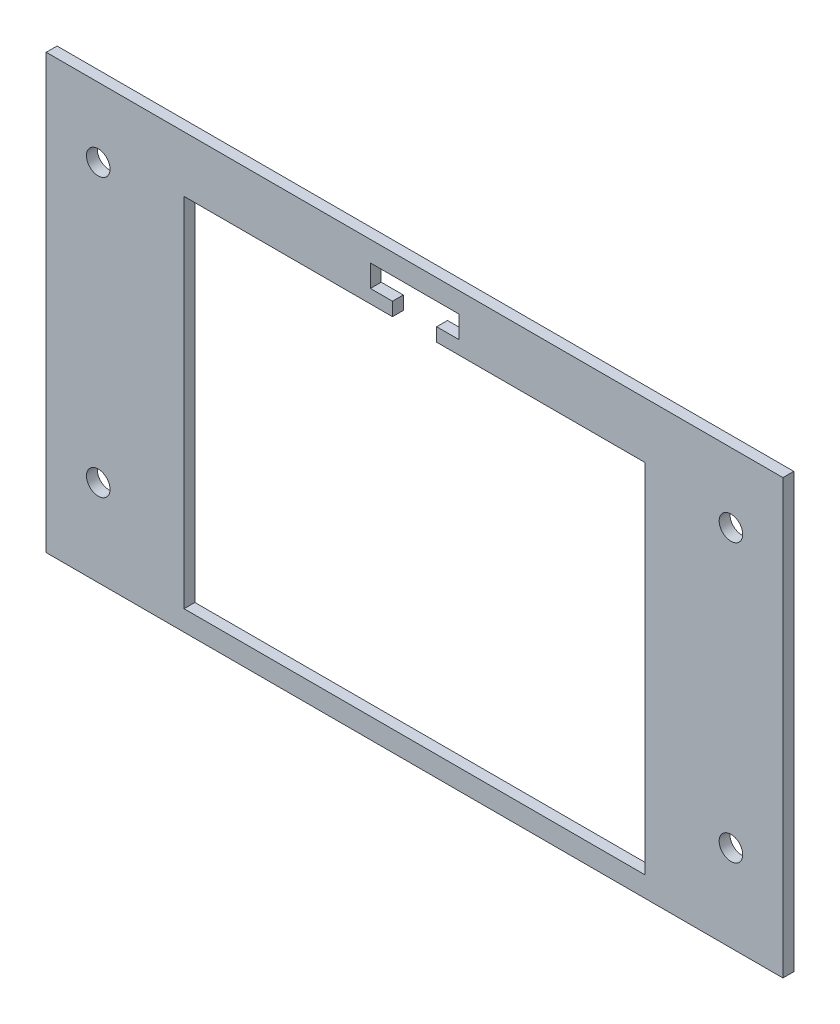
ISO-10303-21;
HEADER;
FILE_DESCRIPTION(('STEP AP214'),'2;1');
FILE_NAME('part.step','',(''),(''),'','','');
FILE_SCHEMA(('AUTOMOTIVE_DESIGN { 1 0 10303 214 1 1 1 1 }'));
ENDSEC;
DATA;
#1=APPLICATION_CONTEXT('core data for automotive mechanical design processes');
#2=APPLICATION_PROTOCOL_DEFINITION('international standard','automotive_design',2000,#1);
#3=PRODUCT_CONTEXT('',#1,'mechanical');
#4=PRODUCT('Part','Part','',(#3));
#5=PRODUCT_RELATED_PRODUCT_CATEGORY('part','',(#4));
#6=PRODUCT_DEFINITION_FORMATION('','',#4);
#7=PRODUCT_DEFINITION_CONTEXT('part definition',#1,'design');
#8=PRODUCT_DEFINITION('design','',#6,#7);
#9=PRODUCT_DEFINITION_SHAPE('','',#8);
#10=(LENGTH_UNIT() NAMED_UNIT(*) SI_UNIT(.MILLI.,.METRE.));
#11=(NAMED_UNIT(*) PLANE_ANGLE_UNIT() SI_UNIT($,.RADIAN.));
#12=(NAMED_UNIT(*) SI_UNIT($,.STERADIAN.) SOLID_ANGLE_UNIT());
#13=UNCERTAINTY_MEASURE_WITH_UNIT(LENGTH_MEASURE(1.E-05),#10,'distance_accuracy_value','');
#14=(GEOMETRIC_REPRESENTATION_CONTEXT(3) GLOBAL_UNCERTAINTY_ASSIGNED_CONTEXT((#13)) GLOBAL_UNIT_ASSIGNED_CONTEXT((#10,
#11,#12)) REPRESENTATION_CONTEXT('',''));
#15=CARTESIAN_POINT('',(0.,0.,0.));
#16=DIRECTION('',(0.,0.,1.));
#17=DIRECTION('',(1.,0.,0.));
#18=AXIS2_PLACEMENT_3D('',#15,#16,#17);
#19=CARTESIAN_POINT('',(53.975,-31.75,1.5875));
#20=DIRECTION('',(-1.,0.,0.));
#21=DIRECTION('',(0.,0.,1.));
#22=AXIS2_PLACEMENT_3D('',#19,#20,#21);
#23=PLANE('',#22);
#24=DIRECTION('',(0.,1.,0.));
#25=VECTOR('',#24,1.);
#26=CARTESIAN_POINT('',(53.975,-31.75,0.));
#27=LINE('',#26,#25);
#28=CARTESIAN_POINT('',(53.975,-31.75,0.));
#29=VERTEX_POINT('',#28);
#30=CARTESIAN_POINT('',(53.975,31.75,0.));
#31=VERTEX_POINT('',#30);
#32=EDGE_CURVE('E221',#29,#31,#27,.T.);
#33=ORIENTED_EDGE('',*,*,#32,.T.);
#34=DIRECTION('',(0.,0.,-1.));
#35=VECTOR('',#34,1.);
#36=CARTESIAN_POINT('',(53.975,31.75,1.5875));
#37=LINE('',#36,#35);
#38=CARTESIAN_POINT('',(53.975,31.75,1.5875));
#39=VERTEX_POINT('',#38);
#40=EDGE_CURVE('E11',#39,#31,#37,.T.);
#41=ORIENTED_EDGE('',*,*,#40,.F.);
#42=DIRECTION('',(0.,1.,0.));
#43=VECTOR('',#42,1.);
#44=CARTESIAN_POINT('',(53.975,-31.75,1.5875));
#45=LINE('',#44,#43);
#46=CARTESIAN_POINT('',(53.975,-31.75,1.5875));
#47=VERTEX_POINT('',#46);
#48=EDGE_CURVE('E241',#47,#39,#45,.T.);
#49=ORIENTED_EDGE('',*,*,#48,.F.);
#50=DIRECTION('',(0.,0.,-1.));
#51=VECTOR('',#50,1.);
#52=CARTESIAN_POINT('',(53.975,-31.75,1.5875));
#53=LINE('',#52,#51);
#54=EDGE_CURVE('E251',#47,#29,#53,.T.);
#55=ORIENTED_EDGE('',*,*,#54,.T.);
#56=EDGE_LOOP('',(#33,#41,#49,#55));
#57=FACE_BOUND('',#56,.T.);
#58=ADVANCED_FACE('F37',(#57),#23,.F.);
#59=CARTESIAN_POINT('',(-53.975,31.75,1.5875));
#60=DIRECTION('',(0.,-1.,0.));
#61=DIRECTION('',(0.,0.,-1.));
#62=AXIS2_PLACEMENT_3D('',#59,#60,#61);
#63=PLANE('',#62);
#64=DIRECTION('',(-1.,0.,0.));
#65=VECTOR('',#64,1.);
#66=CARTESIAN_POINT('',(-53.975,31.75,0.));
#67=LINE('',#66,#65);
#68=CARTESIAN_POINT('',(-53.975,31.75,0.));
#69=VERTEX_POINT('',#68);
#70=EDGE_CURVE('E254',#31,#69,#67,.T.);
#71=ORIENTED_EDGE('',*,*,#70,.T.);
#72=DIRECTION('',(0.,0.,-1.));
#73=VECTOR('',#72,1.);
#74=CARTESIAN_POINT('',(-53.975,31.75,1.5875));
#75=LINE('',#74,#73);
#76=CARTESIAN_POINT('',(-53.975,31.75,1.5875));
#77=VERTEX_POINT('',#76);
#78=EDGE_CURVE('E44',#77,#69,#75,.T.);
#79=ORIENTED_EDGE('',*,*,#78,.F.);
#80=DIRECTION('',(-1.,0.,0.));
#81=VECTOR('',#80,1.);
#82=CARTESIAN_POINT('',(-53.975,31.75,1.5875));
#83=LINE('',#82,#81);
#84=EDGE_CURVE('E244',#39,#77,#83,.T.);
#85=ORIENTED_EDGE('',*,*,#84,.F.);
#86=ORIENTED_EDGE('',*,*,#40,.T.);
#87=EDGE_LOOP('',(#71,#79,#85,#86));
#88=FACE_BOUND('',#87,.T.);
#89=ADVANCED_FACE('F282',(#88),#63,.F.);
#90=CARTESIAN_POINT('',(-53.975,-31.75,1.5875));
#91=DIRECTION('',(1.,0.,0.));
#92=DIRECTION('',(0.,0.,-1.));
#93=AXIS2_PLACEMENT_3D('',#90,#91,#92);
#94=PLANE('',#93);
#95=DIRECTION('',(0.,-1.,0.));
#96=VECTOR('',#95,1.);
#97=CARTESIAN_POINT('',(-53.975,-31.75,0.));
#98=LINE('',#97,#96);
#99=CARTESIAN_POINT('',(-53.975,-31.75,0.));
#100=VERTEX_POINT('',#99);
#101=EDGE_CURVE('E256',#69,#100,#98,.T.);
#102=ORIENTED_EDGE('',*,*,#101,.T.);
#103=DIRECTION('',(0.,0.,-1.));
#104=VECTOR('',#103,1.);
#105=CARTESIAN_POINT('',(-53.975,-31.75,1.5875));
#106=LINE('',#105,#104);
#107=CARTESIAN_POINT('',(-53.975,-31.75,1.5875));
#108=VERTEX_POINT('',#107);
#109=EDGE_CURVE('E261',#108,#100,#106,.T.);
#110=ORIENTED_EDGE('',*,*,#109,.F.);
#111=DIRECTION('',(0.,-1.,0.));
#112=VECTOR('',#111,1.);
#113=CARTESIAN_POINT('',(-53.975,-31.75,1.5875));
#114=LINE('',#113,#112);
#115=EDGE_CURVE('E247',#77,#108,#114,.T.);
#116=ORIENTED_EDGE('',*,*,#115,.F.);
#117=ORIENTED_EDGE('',*,*,#78,.T.);
#118=EDGE_LOOP('',(#102,#110,#116,#117));
#119=FACE_BOUND('',#118,.T.);
#120=ADVANCED_FACE('F268',(#119),#94,.F.);
#121=CARTESIAN_POINT('',(-53.975,-31.75,1.5875));
#122=DIRECTION('',(0.,1.,0.));
#123=DIRECTION('',(0.,0.,1.));
#124=AXIS2_PLACEMENT_3D('',#121,#122,#123);
#125=PLANE('',#124);
#126=DIRECTION('',(1.,0.,0.));
#127=VECTOR('',#126,1.);
#128=CARTESIAN_POINT('',(-53.975,-31.75,0.));
#129=LINE('',#128,#127);
#130=EDGE_CURVE('E245',#100,#29,#129,.T.);
#131=ORIENTED_EDGE('',*,*,#130,.T.);
#132=ORIENTED_EDGE('',*,*,#54,.F.);
#133=DIRECTION('',(1.,0.,0.));
#134=VECTOR('',#133,1.);
#135=CARTESIAN_POINT('',(-53.975,-31.75,1.5875));
#136=LINE('',#135,#134);
#137=EDGE_CURVE('E249',#108,#47,#136,.T.);
#138=ORIENTED_EDGE('',*,*,#137,.F.);
#139=ORIENTED_EDGE('',*,*,#109,.T.);
#140=EDGE_LOOP('',(#131,#132,#138,#139));
#141=FACE_BOUND('',#140,.T.);
#142=ADVANCED_FACE('F275',(#141),#125,.F.);
#143=CARTESIAN_POINT('',(0.,0.,1.5875));
#144=DIRECTION('',(0.,0.,-1.));
#145=DIRECTION('',(-1.,0.,0.));
#146=AXIS2_PLACEMENT_3D('',#143,#144,#145);
#147=PLANE('',#146);
#148=CARTESIAN_POINT('',(-46.355,21.59,1.5875));
#149=DIRECTION('',(0.,0.,1.));
#150=DIRECTION('',(1.,0.,0.));
#151=AXIS2_PLACEMENT_3D('',#148,#149,#150);
#152=CIRCLE('',#151,1.72719999999999);
#153=CARTESIAN_POINT('',(-44.6278,21.59,1.5875));
#154=VERTEX_POINT('',#153);
#155=EDGE_CURVE('E362',#154,#154,#152,.T.);
#156=ORIENTED_EDGE('',*,*,#155,.F.);
#157=EDGE_LOOP('',(#156));
#158=FACE_BOUND('',#157,.T.);
#159=CARTESIAN_POINT('',(-46.355,-19.05,1.5875));
#160=DIRECTION('',(0.,0.,1.));
#161=DIRECTION('',(1.,0.,0.));
#162=AXIS2_PLACEMENT_3D('',#159,#160,#161);
#163=CIRCLE('',#162,1.72719999999999);
#164=CARTESIAN_POINT('',(-44.6278,-19.05,1.5875));
#165=VERTEX_POINT('',#164);
#166=EDGE_CURVE('E364',#165,#165,#163,.T.);
#167=ORIENTED_EDGE('',*,*,#166,.F.);
#168=EDGE_LOOP('',(#167));
#169=FACE_BOUND('',#168,.T.);
#170=CARTESIAN_POINT('',(46.355,21.59,1.5875));
#171=DIRECTION('',(0.,0.,1.));
#172=DIRECTION('',(1.,0.,0.));
#173=AXIS2_PLACEMENT_3D('',#170,#171,#172);
#174=CIRCLE('',#173,1.72719999999999);
#175=CARTESIAN_POINT('',(48.0822,21.59,1.5875));
#176=VERTEX_POINT('',#175);
#177=EDGE_CURVE('E372',#176,#176,#174,.T.);
#178=ORIENTED_EDGE('',*,*,#177,.F.);
#179=EDGE_LOOP('',(#178));
#180=FACE_BOUND('',#179,.T.);
#181=CARTESIAN_POINT('',(46.355,-19.05,1.5875));
#182=DIRECTION('',(0.,0.,1.));
#183=DIRECTION('',(1.,0.,0.));
#184=AXIS2_PLACEMENT_3D('',#181,#182,#183);
#185=CIRCLE('',#184,1.72719999999999);
#186=CARTESIAN_POINT('',(48.0822,-19.05,1.5875));
#187=VERTEX_POINT('',#186);
#188=EDGE_CURVE('E378',#187,#187,#185,.T.);
#189=ORIENTED_EDGE('',*,*,#188,.F.);
#190=EDGE_LOOP('',(#189));
#191=FACE_BOUND('',#190,.T.);
#192=DIRECTION('',(0.,-1.,0.));
#193=VECTOR('',#192,1.);
#194=CARTESIAN_POINT('',(3.23850000000005,0.,1.5875));
#195=LINE('',#194,#193);
#196=CARTESIAN_POINT('',(3.2385,25.527,1.5875));
#197=VERTEX_POINT('',#196);
#198=CARTESIAN_POINT('',(3.2385,23.5585,1.5875));
#199=VERTEX_POINT('',#198);
#200=EDGE_CURVE('E192',#197,#199,#195,.T.);
#201=ORIENTED_EDGE('',*,*,#200,.T.);
#202=DIRECTION('',(-1.,0.,0.));
#203=VECTOR('',#202,1.);
#204=CARTESIAN_POINT('',(0.,23.5585,1.5875));
#205=LINE('',#204,#203);
#206=CARTESIAN_POINT('',(33.782,23.5585,1.5875));
#207=VERTEX_POINT('',#206);
#208=EDGE_CURVE('E51',#207,#199,#205,.T.);
#209=ORIENTED_EDGE('',*,*,#208,.F.);
#210=DIRECTION('',(0.,-1.,0.));
#211=VECTOR('',#210,1.);
#212=CARTESIAN_POINT('',(33.782,0.,1.5875));
#213=LINE('',#212,#211);
#214=CARTESIAN_POINT('',(33.782,-28.7655,1.5875));
#215=VERTEX_POINT('',#214);
#216=EDGE_CURVE('E166',#207,#215,#213,.T.);
#217=ORIENTED_EDGE('',*,*,#216,.T.);
#218=DIRECTION('',(-1.,0.,0.));
#219=VECTOR('',#218,1.);
#220=CARTESIAN_POINT('',(0.,-28.7655,1.5875));
#221=LINE('',#220,#219);
#222=CARTESIAN_POINT('',(-33.782,-28.7655,1.5875));
#223=VERTEX_POINT('',#222);
#224=EDGE_CURVE('E170',#215,#223,#221,.T.);
#225=ORIENTED_EDGE('',*,*,#224,.T.);
#226=DIRECTION('',(0.,-1.,0.));
#227=VECTOR('',#226,1.);
#228=CARTESIAN_POINT('',(-33.782,0.,1.5875));
#229=LINE('',#228,#227);
#230=CARTESIAN_POINT('',(-33.782,23.5585,1.5875));
#231=VERTEX_POINT('',#230);
#232=EDGE_CURVE('E214',#231,#223,#229,.T.);
#233=ORIENTED_EDGE('',*,*,#232,.F.);
#234=CARTESIAN_POINT('',(-3.2385,23.5585,1.5875));
#235=VERTEX_POINT('',#234);
#236=EDGE_CURVE('E194',#235,#231,#205,.T.);
#237=ORIENTED_EDGE('',*,*,#236,.F.);
#238=DIRECTION('',(0.,1.,0.));
#239=VECTOR('',#238,1.);
#240=CARTESIAN_POINT('',(-3.23850000000001,0.,1.5875));
#241=LINE('',#240,#239);
#242=CARTESIAN_POINT('',(-3.2385,25.527,1.5875));
#243=VERTEX_POINT('',#242);
#244=EDGE_CURVE('E211',#235,#243,#241,.T.);
#245=ORIENTED_EDGE('',*,*,#244,.T.);
#246=DIRECTION('',(-1.,0.,0.));
#247=VECTOR('',#246,1.);
#248=CARTESIAN_POINT('',(0.,25.527,1.5875));
#249=LINE('',#248,#247);
#250=CARTESIAN_POINT('',(-6.477,25.527,1.5875));
#251=VERTEX_POINT('',#250);
#252=EDGE_CURVE('E208',#243,#251,#249,.T.);
#253=ORIENTED_EDGE('',*,*,#252,.T.);
#254=DIRECTION('',(0.,1.,0.));
#255=VECTOR('',#254,1.);
#256=CARTESIAN_POINT('',(-6.47699999999999,0.,1.5875));
#257=LINE('',#256,#255);
#258=CARTESIAN_POINT('',(-6.477,28.7655,1.5875));
#259=VERTEX_POINT('',#258);
#260=EDGE_CURVE('E205',#251,#259,#257,.T.);
#261=ORIENTED_EDGE('',*,*,#260,.T.);
#262=DIRECTION('',(1.,0.,0.));
#263=VECTOR('',#262,1.);
#264=CARTESIAN_POINT('',(0.,28.7655,1.5875));
#265=LINE('',#264,#263);
#266=CARTESIAN_POINT('',(6.477,28.7655,1.5875));
#267=VERTEX_POINT('',#266);
#268=EDGE_CURVE('E202',#259,#267,#265,.T.);
#269=ORIENTED_EDGE('',*,*,#268,.T.);
#270=DIRECTION('',(0.,-1.,0.));
#271=VECTOR('',#270,1.);
#272=CARTESIAN_POINT('',(6.47700000000001,0.,1.5875));
#273=LINE('',#272,#271);
#274=CARTESIAN_POINT('',(6.477,25.527,1.5875));
#275=VERTEX_POINT('',#274);
#276=EDGE_CURVE('E199',#267,#275,#273,.T.);
#277=ORIENTED_EDGE('',*,*,#276,.T.);
#278=DIRECTION('',(-1.,0.,0.));
#279=VECTOR('',#278,1.);
#280=CARTESIAN_POINT('',(0.,25.527,1.5875));
#281=LINE('',#280,#279);
#282=EDGE_CURVE('E196',#275,#197,#281,.T.);
#283=ORIENTED_EDGE('',*,*,#282,.T.);
#284=EDGE_LOOP('',(#201,#209,#217,#225,#233,#237,#245,#253,#261,#269,#277,#283));
#285=FACE_BOUND('',#284,.T.);
#286=ORIENTED_EDGE('',*,*,#48,.T.);
#287=ORIENTED_EDGE('',*,*,#84,.T.);
#288=ORIENTED_EDGE('',*,*,#115,.T.);
#289=ORIENTED_EDGE('',*,*,#137,.T.);
#290=EDGE_LOOP('',(#286,#287,#288,#289));
#291=FACE_BOUND('',#290,.T.);
#292=ADVANCED_FACE('F281',(#158,#169,#180,#191,#285,#291),#147,.F.);
#293=CARTESIAN_POINT('',(0.,0.,0.));
#294=DIRECTION('',(0.,0.,-1.));
#295=DIRECTION('',(-1.,0.,0.));
#296=AXIS2_PLACEMENT_3D('',#293,#294,#295);
#297=PLANE('',#296);
#298=CARTESIAN_POINT('',(-46.355,21.59,0.));
#299=DIRECTION('',(0.,0.,1.));
#300=DIRECTION('',(1.,0.,0.));
#301=AXIS2_PLACEMENT_3D('',#298,#299,#300);
#302=CIRCLE('',#301,1.7272);
#303=CARTESIAN_POINT('',(-44.6278,21.59,0.));
#304=VERTEX_POINT('',#303);
#305=EDGE_CURVE('E359',#304,#304,#302,.T.);
#306=ORIENTED_EDGE('',*,*,#305,.T.);
#307=EDGE_LOOP('',(#306));
#308=FACE_BOUND('',#307,.T.);
#309=CARTESIAN_POINT('',(-46.355,-19.05,0.));
#310=DIRECTION('',(0.,0.,1.));
#311=DIRECTION('',(1.,0.,0.));
#312=AXIS2_PLACEMENT_3D('',#309,#310,#311);
#313=CIRCLE('',#312,1.7272);
#314=CARTESIAN_POINT('',(-44.6278,-19.05,0.));
#315=VERTEX_POINT('',#314);
#316=EDGE_CURVE('E369',#315,#315,#313,.T.);
#317=ORIENTED_EDGE('',*,*,#316,.T.);
#318=EDGE_LOOP('',(#317));
#319=FACE_BOUND('',#318,.T.);
#320=CARTESIAN_POINT('',(46.355,21.59,0.));
#321=DIRECTION('',(0.,0.,1.));
#322=DIRECTION('',(1.,0.,0.));
#323=AXIS2_PLACEMENT_3D('',#320,#321,#322);
#324=CIRCLE('',#323,1.7272);
#325=CARTESIAN_POINT('',(48.0822,21.59,0.));
#326=VERTEX_POINT('',#325);
#327=EDGE_CURVE('E375',#326,#326,#324,.T.);
#328=ORIENTED_EDGE('',*,*,#327,.T.);
#329=EDGE_LOOP('',(#328));
#330=FACE_BOUND('',#329,.T.);
#331=CARTESIAN_POINT('',(46.355,-19.05,0.));
#332=DIRECTION('',(0.,0.,1.));
#333=DIRECTION('',(1.,0.,0.));
#334=AXIS2_PLACEMENT_3D('',#331,#332,#333);
#335=CIRCLE('',#334,1.7272);
#336=CARTESIAN_POINT('',(48.0822,-19.05,0.));
#337=VERTEX_POINT('',#336);
#338=EDGE_CURVE('E193',#337,#337,#335,.T.);
#339=ORIENTED_EDGE('',*,*,#338,.T.);
#340=EDGE_LOOP('',(#339));
#341=FACE_BOUND('',#340,.T.);
#342=DIRECTION('',(-1.,0.,0.));
#343=VECTOR('',#342,1.);
#344=CARTESIAN_POINT('',(0.,23.5585,0.));
#345=LINE('',#344,#343);
#346=CARTESIAN_POINT('',(33.782,23.5585,0.));
#347=VERTEX_POINT('',#346);
#348=CARTESIAN_POINT('',(3.2385,23.5585,0.));
#349=VERTEX_POINT('',#348);
#350=EDGE_CURVE('E156',#347,#349,#345,.T.);
#351=ORIENTED_EDGE('',*,*,#350,.T.);
#352=DIRECTION('',(0.,-1.,0.));
#353=VECTOR('',#352,1.);
#354=CARTESIAN_POINT('',(3.23850000000005,0.,0.));
#355=LINE('',#354,#353);
#356=CARTESIAN_POINT('',(3.2385,25.527,0.));
#357=VERTEX_POINT('',#356);
#358=EDGE_CURVE('E148',#357,#349,#355,.T.);
#359=ORIENTED_EDGE('',*,*,#358,.F.);
#360=DIRECTION('',(-1.,0.,0.));
#361=VECTOR('',#360,1.);
#362=CARTESIAN_POINT('',(0.,25.527,0.));
#363=LINE('',#362,#361);
#364=CARTESIAN_POINT('',(6.477,25.527,0.));
#365=VERTEX_POINT('',#364);
#366=EDGE_CURVE('E155',#365,#357,#363,.T.);
#367=ORIENTED_EDGE('',*,*,#366,.F.);
#368=DIRECTION('',(0.,-1.,0.));
#369=VECTOR('',#368,1.);
#370=CARTESIAN_POINT('',(6.47700000000001,0.,0.));
#371=LINE('',#370,#369);
#372=CARTESIAN_POINT('',(6.477,28.7655,0.));
#373=VERTEX_POINT('',#372);
#374=EDGE_CURVE('E391',#373,#365,#371,.T.);
#375=ORIENTED_EDGE('',*,*,#374,.F.);
#376=DIRECTION('',(1.,0.,0.));
#377=VECTOR('',#376,1.);
#378=CARTESIAN_POINT('',(0.,28.7655,0.));
#379=LINE('',#378,#377);
#380=CARTESIAN_POINT('',(-6.477,28.7655,0.));
#381=VERTEX_POINT('',#380);
#382=EDGE_CURVE('E393',#381,#373,#379,.T.);
#383=ORIENTED_EDGE('',*,*,#382,.F.);
#384=DIRECTION('',(0.,1.,0.));
#385=VECTOR('',#384,1.);
#386=CARTESIAN_POINT('',(-6.47699999999999,0.,0.));
#387=LINE('',#386,#385);
#388=CARTESIAN_POINT('',(-6.477,25.527,0.));
#389=VERTEX_POINT('',#388);
#390=EDGE_CURVE('E185',#389,#381,#387,.T.);
#391=ORIENTED_EDGE('',*,*,#390,.F.);
#392=DIRECTION('',(-1.,0.,0.));
#393=VECTOR('',#392,1.);
#394=CARTESIAN_POINT('',(0.,25.527,0.));
#395=LINE('',#394,#393);
#396=CARTESIAN_POINT('',(-3.2385,25.527,0.));
#397=VERTEX_POINT('',#396);
#398=EDGE_CURVE('E181',#397,#389,#395,.T.);
#399=ORIENTED_EDGE('',*,*,#398,.F.);
#400=DIRECTION('',(0.,1.,0.));
#401=VECTOR('',#400,1.);
#402=CARTESIAN_POINT('',(-3.23850000000001,0.,0.));
#403=LINE('',#402,#401);
#404=CARTESIAN_POINT('',(-3.2385,23.5585,0.));
#405=VERTEX_POINT('',#404);
#406=EDGE_CURVE('E175',#405,#397,#403,.T.);
#407=ORIENTED_EDGE('',*,*,#406,.F.);
#408=CARTESIAN_POINT('',(-33.782,23.5585,0.));
#409=VERTEX_POINT('',#408);
#410=EDGE_CURVE('E168',#405,#409,#345,.T.);
#411=ORIENTED_EDGE('',*,*,#410,.T.);
#412=DIRECTION('',(0.,-1.,0.));
#413=VECTOR('',#412,1.);
#414=CARTESIAN_POINT('',(-33.782,0.,0.));
#415=LINE('',#414,#413);
#416=CARTESIAN_POINT('',(-33.782,-28.7655,0.));
#417=VERTEX_POINT('',#416);
#418=EDGE_CURVE('E174',#409,#417,#415,.T.);
#419=ORIENTED_EDGE('',*,*,#418,.T.);
#420=DIRECTION('',(-1.,0.,0.));
#421=VECTOR('',#420,1.);
#422=CARTESIAN_POINT('',(0.,-28.7655,0.));
#423=LINE('',#422,#421);
#424=CARTESIAN_POINT('',(33.782,-28.7655,0.));
#425=VERTEX_POINT('',#424);
#426=EDGE_CURVE('E179',#425,#417,#423,.T.);
#427=ORIENTED_EDGE('',*,*,#426,.F.);
#428=DIRECTION('',(0.,-1.,0.));
#429=VECTOR('',#428,1.);
#430=CARTESIAN_POINT('',(33.782,0.,0.));
#431=LINE('',#430,#429);
#432=EDGE_CURVE('E161',#347,#425,#431,.T.);
#433=ORIENTED_EDGE('',*,*,#432,.F.);
#434=EDGE_LOOP('',(#351,#359,#367,#375,#383,#391,#399,#407,#411,#419,#427,#433));
#435=FACE_BOUND('',#434,.T.);
#436=ORIENTED_EDGE('',*,*,#32,.F.);
#437=ORIENTED_EDGE('',*,*,#130,.F.);
#438=ORIENTED_EDGE('',*,*,#101,.F.);
#439=ORIENTED_EDGE('',*,*,#70,.F.);
#440=EDGE_LOOP('',(#436,#437,#438,#439));
#441=FACE_BOUND('',#440,.T.);
#442=ADVANCED_FACE('F163',(#308,#319,#330,#341,#435,#441),#297,.T.);
#443=CARTESIAN_POINT('',(0.,23.5585,0.));
#444=DIRECTION('',(0.,1.,0.));
#445=DIRECTION('',(-1.,0.,0.));
#446=AXIS2_PLACEMENT_3D('',#443,#444,#445);
#447=PLANE('',#446);
#448=ORIENTED_EDGE('',*,*,#208,.T.);
#449=DIRECTION('',(0.,0.,1.));
#450=VECTOR('',#449,1.);
#451=CARTESIAN_POINT('',(3.2385,23.5585,0.));
#452=LINE('',#451,#450);
#453=EDGE_CURVE('E150',#349,#199,#452,.T.);
#454=ORIENTED_EDGE('',*,*,#453,.F.);
#455=ORIENTED_EDGE('',*,*,#350,.F.);
#456=DIRECTION('',(0.,0.,1.));
#457=VECTOR('',#456,1.);
#458=CARTESIAN_POINT('',(33.782,23.5585,0.));
#459=LINE('',#458,#457);
#460=EDGE_CURVE('E219',#347,#207,#459,.T.);
#461=ORIENTED_EDGE('',*,*,#460,.T.);
#462=EDGE_LOOP('',(#448,#454,#455,#461));
#463=FACE_BOUND('',#462,.T.);
#464=ADVANCED_FACE('F159',(#463),#447,.F.);
#465=CARTESIAN_POINT('',(33.782,0.,0.));
#466=DIRECTION('',(-1.,0.,0.));
#467=DIRECTION('',(0.,-1.,0.));
#468=AXIS2_PLACEMENT_3D('',#465,#466,#467);
#469=PLANE('',#468);
#470=ORIENTED_EDGE('',*,*,#216,.F.);
#471=ORIENTED_EDGE('',*,*,#460,.F.);
#472=ORIENTED_EDGE('',*,*,#432,.T.);
#473=DIRECTION('',(0.,0.,1.));
#474=VECTOR('',#473,1.);
#475=CARTESIAN_POINT('',(33.782,-28.7655,0.));
#476=LINE('',#475,#474);
#477=EDGE_CURVE('E222',#425,#215,#476,.T.);
#478=ORIENTED_EDGE('',*,*,#477,.T.);
#479=EDGE_LOOP('',(#470,#471,#472,#478));
#480=FACE_BOUND('',#479,.T.);
#481=ADVANCED_FACE('F335',(#480),#469,.T.);
#482=CARTESIAN_POINT('',(0.,-28.7655,0.));
#483=DIRECTION('',(0.,1.,0.));
#484=DIRECTION('',(-1.,0.,0.));
#485=AXIS2_PLACEMENT_3D('',#482,#483,#484);
#486=PLANE('',#485);
#487=ORIENTED_EDGE('',*,*,#224,.F.);
#488=ORIENTED_EDGE('',*,*,#477,.F.);
#489=ORIENTED_EDGE('',*,*,#426,.T.);
#490=DIRECTION('',(0.,0.,1.));
#491=VECTOR('',#490,1.);
#492=CARTESIAN_POINT('',(-33.782,-28.7655,0.));
#493=LINE('',#492,#491);
#494=EDGE_CURVE('E224',#417,#223,#493,.T.);
#495=ORIENTED_EDGE('',*,*,#494,.T.);
#496=EDGE_LOOP('',(#487,#488,#489,#495));
#497=FACE_BOUND('',#496,.T.);
#498=ADVANCED_FACE('F331',(#497),#486,.T.);
#499=CARTESIAN_POINT('',(-33.782,0.,0.));
#500=DIRECTION('',(-1.,0.,0.));
#501=DIRECTION('',(0.,-1.,0.));
#502=AXIS2_PLACEMENT_3D('',#499,#500,#501);
#503=PLANE('',#502);
#504=ORIENTED_EDGE('',*,*,#232,.T.);
#505=ORIENTED_EDGE('',*,*,#494,.F.);
#506=ORIENTED_EDGE('',*,*,#418,.F.);
#507=DIRECTION('',(0.,0.,1.));
#508=VECTOR('',#507,1.);
#509=CARTESIAN_POINT('',(-33.782,23.5585,0.));
#510=LINE('',#509,#508);
#511=EDGE_CURVE('E226',#409,#231,#510,.T.);
#512=ORIENTED_EDGE('',*,*,#511,.T.);
#513=EDGE_LOOP('',(#504,#505,#506,#512));
#514=FACE_BOUND('',#513,.T.);
#515=ADVANCED_FACE('F327',(#514),#503,.F.);
#516=ORIENTED_EDGE('',*,*,#236,.T.);
#517=ORIENTED_EDGE('',*,*,#511,.F.);
#518=ORIENTED_EDGE('',*,*,#410,.F.);
#519=DIRECTION('',(0.,0.,1.));
#520=VECTOR('',#519,1.);
#521=CARTESIAN_POINT('',(-3.2385,23.5585,0.));
#522=LINE('',#521,#520);
#523=EDGE_CURVE('E228',#405,#235,#522,.T.);
#524=ORIENTED_EDGE('',*,*,#523,.T.);
#525=EDGE_LOOP('',(#516,#517,#518,#524));
#526=FACE_BOUND('',#525,.T.);
#527=ADVANCED_FACE('F324',(#526),#447,.F.);
#528=CARTESIAN_POINT('',(-3.23850000000001,0.,0.));
#529=DIRECTION('',(1.,0.,0.));
#530=DIRECTION('',(0.,1.,0.));
#531=AXIS2_PLACEMENT_3D('',#528,#529,#530);
#532=PLANE('',#531);
#533=ORIENTED_EDGE('',*,*,#244,.F.);
#534=ORIENTED_EDGE('',*,*,#523,.F.);
#535=ORIENTED_EDGE('',*,*,#406,.T.);
#536=DIRECTION('',(0.,0.,1.));
#537=VECTOR('',#536,1.);
#538=CARTESIAN_POINT('',(-3.2385,25.527,0.));
#539=LINE('',#538,#537);
#540=EDGE_CURVE('E230',#397,#243,#539,.T.);
#541=ORIENTED_EDGE('',*,*,#540,.T.);
#542=EDGE_LOOP('',(#533,#534,#535,#541));
#543=FACE_BOUND('',#542,.T.);
#544=ADVANCED_FACE('F320',(#543),#532,.T.);
#545=CARTESIAN_POINT('',(0.,25.527,0.));
#546=DIRECTION('',(0.,1.,0.));
#547=DIRECTION('',(0.,0.,1.));
#548=AXIS2_PLACEMENT_3D('',#545,#546,#547);
#549=PLANE('',#548);
#550=ORIENTED_EDGE('',*,*,#252,.F.);
#551=ORIENTED_EDGE('',*,*,#540,.F.);
#552=ORIENTED_EDGE('',*,*,#398,.T.);
#553=DIRECTION('',(0.,0.,1.));
#554=VECTOR('',#553,1.);
#555=CARTESIAN_POINT('',(-6.477,25.527,0.));
#556=LINE('',#555,#554);
#557=EDGE_CURVE('E232',#389,#251,#556,.T.);
#558=ORIENTED_EDGE('',*,*,#557,.T.);
#559=EDGE_LOOP('',(#550,#551,#552,#558));
#560=FACE_BOUND('',#559,.T.);
#561=ADVANCED_FACE('F316',(#560),#549,.T.);
#562=CARTESIAN_POINT('',(-6.47699999999999,0.,0.));
#563=DIRECTION('',(1.,0.,0.));
#564=DIRECTION('',(0.,1.,0.));
#565=AXIS2_PLACEMENT_3D('',#562,#563,#564);
#566=PLANE('',#565);
#567=ORIENTED_EDGE('',*,*,#260,.F.);
#568=ORIENTED_EDGE('',*,*,#557,.F.);
#569=ORIENTED_EDGE('',*,*,#390,.T.);
#570=DIRECTION('',(0.,0.,1.));
#571=VECTOR('',#570,1.);
#572=CARTESIAN_POINT('',(-6.477,28.7655,0.));
#573=LINE('',#572,#571);
#574=EDGE_CURVE('E234',#381,#259,#573,.T.);
#575=ORIENTED_EDGE('',*,*,#574,.T.);
#576=EDGE_LOOP('',(#567,#568,#569,#575));
#577=FACE_BOUND('',#576,.T.);
#578=ADVANCED_FACE('F312',(#577),#566,.T.);
#579=CARTESIAN_POINT('',(0.,28.7655,0.));
#580=DIRECTION('',(0.,-1.,0.));
#581=DIRECTION('',(1.,0.,0.));
#582=AXIS2_PLACEMENT_3D('',#579,#580,#581);
#583=PLANE('',#582);
#584=ORIENTED_EDGE('',*,*,#268,.F.);
#585=ORIENTED_EDGE('',*,*,#574,.F.);
#586=ORIENTED_EDGE('',*,*,#382,.T.);
#587=DIRECTION('',(0.,0.,1.));
#588=VECTOR('',#587,1.);
#589=CARTESIAN_POINT('',(6.477,28.7655,0.));
#590=LINE('',#589,#588);
#591=EDGE_CURVE('E236',#373,#267,#590,.T.);
#592=ORIENTED_EDGE('',*,*,#591,.T.);
#593=EDGE_LOOP('',(#584,#585,#586,#592));
#594=FACE_BOUND('',#593,.T.);
#595=ADVANCED_FACE('F308',(#594),#583,.T.);
#596=CARTESIAN_POINT('',(6.47700000000001,0.,0.));
#597=DIRECTION('',(-1.,0.,0.));
#598=DIRECTION('',(0.,-1.,0.));
#599=AXIS2_PLACEMENT_3D('',#596,#597,#598);
#600=PLANE('',#599);
#601=ORIENTED_EDGE('',*,*,#276,.F.);
#602=ORIENTED_EDGE('',*,*,#591,.F.);
#603=ORIENTED_EDGE('',*,*,#374,.T.);
#604=DIRECTION('',(0.,0.,1.));
#605=VECTOR('',#604,1.);
#606=CARTESIAN_POINT('',(6.477,25.527,0.));
#607=LINE('',#606,#605);
#608=EDGE_CURVE('E238',#365,#275,#607,.T.);
#609=ORIENTED_EDGE('',*,*,#608,.T.);
#610=EDGE_LOOP('',(#601,#602,#603,#609));
#611=FACE_BOUND('',#610,.T.);
#612=ADVANCED_FACE('F304',(#611),#600,.T.);
#613=CARTESIAN_POINT('',(0.,25.527,0.));
#614=DIRECTION('',(0.,1.,0.));
#615=DIRECTION('',(0.,0.,1.));
#616=AXIS2_PLACEMENT_3D('',#613,#614,#615);
#617=PLANE('',#616);
#618=ORIENTED_EDGE('',*,*,#282,.F.);
#619=ORIENTED_EDGE('',*,*,#608,.F.);
#620=ORIENTED_EDGE('',*,*,#366,.T.);
#621=DIRECTION('',(0.,0.,1.));
#622=VECTOR('',#621,1.);
#623=CARTESIAN_POINT('',(3.2385,25.527,0.));
#624=LINE('',#623,#622);
#625=EDGE_CURVE('E59',#357,#197,#624,.T.);
#626=ORIENTED_EDGE('',*,*,#625,.T.);
#627=EDGE_LOOP('',(#618,#619,#620,#626));
#628=FACE_BOUND('',#627,.T.);
#629=ADVANCED_FACE('F301',(#628),#617,.T.);
#630=CARTESIAN_POINT('',(3.23850000000005,0.,0.));
#631=DIRECTION('',(-1.,0.,0.));
#632=DIRECTION('',(0.,-1.,0.));
#633=AXIS2_PLACEMENT_3D('',#630,#631,#632);
#634=PLANE('',#633);
#635=ORIENTED_EDGE('',*,*,#200,.F.);
#636=ORIENTED_EDGE('',*,*,#625,.F.);
#637=ORIENTED_EDGE('',*,*,#358,.T.);
#638=ORIENTED_EDGE('',*,*,#453,.T.);
#639=EDGE_LOOP('',(#635,#636,#637,#638));
#640=FACE_BOUND('',#639,.T.);
#641=ADVANCED_FACE('F149',(#640),#634,.T.);
#642=CARTESIAN_POINT('',(46.355,-19.05,1.5875));
#643=DIRECTION('',(0.,0.,1.));
#644=DIRECTION('',(1.,0.,0.));
#645=AXIS2_PLACEMENT_3D('',#642,#643,#644);
#646=CYLINDRICAL_SURFACE('',#645,1.72719999999999);
#647=ORIENTED_EDGE('',*,*,#338,.F.);
#648=EDGE_LOOP('',(#647));
#649=FACE_BOUND('',#648,.T.);
#650=ORIENTED_EDGE('',*,*,#188,.T.);
#651=EDGE_LOOP('',(#650));
#652=FACE_BOUND('',#651,.T.);
#653=ADVANCED_FACE('F300',(#649,#652),#646,.F.);
#654=CARTESIAN_POINT('',(46.355,21.59,1.5875));
#655=DIRECTION('',(0.,0.,1.));
#656=DIRECTION('',(1.,0.,0.));
#657=AXIS2_PLACEMENT_3D('',#654,#655,#656);
#658=CYLINDRICAL_SURFACE('',#657,1.72719999999999);
#659=ORIENTED_EDGE('',*,*,#327,.F.);
#660=EDGE_LOOP('',(#659));
#661=FACE_BOUND('',#660,.T.);
#662=ORIENTED_EDGE('',*,*,#177,.T.);
#663=EDGE_LOOP('',(#662));
#664=FACE_BOUND('',#663,.T.);
#665=ADVANCED_FACE('F342',(#661,#664),#658,.F.);
#666=CARTESIAN_POINT('',(-46.355,-19.05,1.5875));
#667=DIRECTION('',(0.,0.,1.));
#668=DIRECTION('',(1.,0.,0.));
#669=AXIS2_PLACEMENT_3D('',#666,#667,#668);
#670=CYLINDRICAL_SURFACE('',#669,1.72719999999999);
#671=ORIENTED_EDGE('',*,*,#316,.F.);
#672=EDGE_LOOP('',(#671));
#673=FACE_BOUND('',#672,.T.);
#674=ORIENTED_EDGE('',*,*,#166,.T.);
#675=EDGE_LOOP('',(#674));
#676=FACE_BOUND('',#675,.T.);
#677=ADVANCED_FACE('F346',(#673,#676),#670,.F.);
#678=CARTESIAN_POINT('',(-46.355,21.59,1.5875));
#679=DIRECTION('',(0.,0.,1.));
#680=DIRECTION('',(1.,0.,0.));
#681=AXIS2_PLACEMENT_3D('',#678,#679,#680);
#682=CYLINDRICAL_SURFACE('',#681,1.72719999999999);
#683=ORIENTED_EDGE('',*,*,#305,.F.);
#684=EDGE_LOOP('',(#683));
#685=FACE_BOUND('',#684,.T.);
#686=ORIENTED_EDGE('',*,*,#155,.T.);
#687=EDGE_LOOP('',(#686));
#688=FACE_BOUND('',#687,.T.);
#689=ADVANCED_FACE('F350',(#685,#688),#682,.F.);
#690=CLOSED_SHELL('',(#58,#89,#120,#142,#292,#442,#464,#481,#498,#515,#527,#544,#561,#578,#595,
#612,#629,#641,#653,#665,#677,#689));
#691=MANIFOLD_SOLID_BREP('B2',#690);
#692=ADVANCED_BREP_SHAPE_REPRESENTATION('',(#18,#691),#14);
#693=SHAPE_DEFINITION_REPRESENTATION(#9,#692);
ENDSEC;
END-ISO-10303-21;
